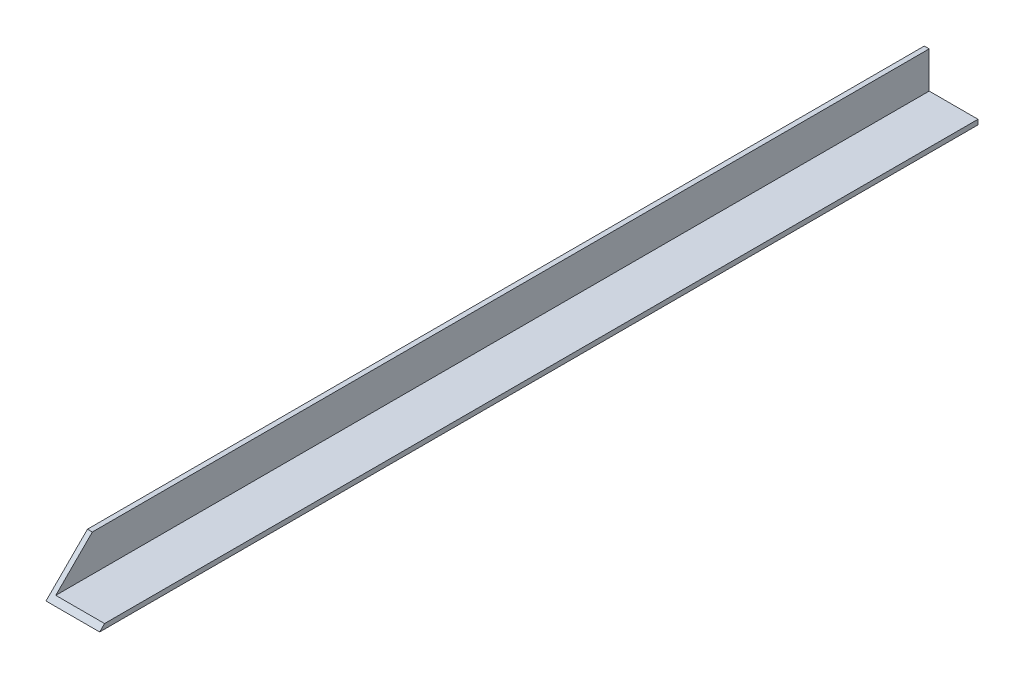
ISO-10303-21;
HEADER;
FILE_DESCRIPTION(('STEP AP214'),'2;1');
FILE_NAME('part.step','',(''),(''),'','','');
FILE_SCHEMA(('AUTOMOTIVE_DESIGN { 1 0 10303 214 1 1 1 1 }'));
ENDSEC;
DATA;
#1=APPLICATION_CONTEXT('core data for automotive mechanical design processes');
#2=APPLICATION_PROTOCOL_DEFINITION('international standard','automotive_design',2000,#1);
#3=PRODUCT_CONTEXT('',#1,'mechanical');
#4=PRODUCT('Part','Part','',(#3));
#5=PRODUCT_RELATED_PRODUCT_CATEGORY('part','',(#4));
#6=PRODUCT_DEFINITION_FORMATION('','',#4);
#7=PRODUCT_DEFINITION_CONTEXT('part definition',#1,'design');
#8=PRODUCT_DEFINITION('design','',#6,#7);
#9=PRODUCT_DEFINITION_SHAPE('','',#8);
#10=(LENGTH_UNIT() NAMED_UNIT(*) SI_UNIT(.MILLI.,.METRE.));
#11=(NAMED_UNIT(*) PLANE_ANGLE_UNIT() SI_UNIT($,.RADIAN.));
#12=(NAMED_UNIT(*) SI_UNIT($,.STERADIAN.) SOLID_ANGLE_UNIT());
#13=UNCERTAINTY_MEASURE_WITH_UNIT(LENGTH_MEASURE(1.E-05),#10,'distance_accuracy_value','');
#14=(GEOMETRIC_REPRESENTATION_CONTEXT(3) GLOBAL_UNCERTAINTY_ASSIGNED_CONTEXT((#13)) GLOBAL_UNIT_ASSIGNED_CONTEXT((#10,
#11,#12)) REPRESENTATION_CONTEXT('',''));
#15=CARTESIAN_POINT('',(0.,0.,0.));
#16=DIRECTION('',(0.,0.,1.));
#17=DIRECTION('',(1.,0.,0.));
#18=AXIS2_PLACEMENT_3D('',#15,#16,#17);
#19=CARTESIAN_POINT('',(0.,0.,-360.));
#20=DIRECTION('',(-1.,0.,0.));
#21=DIRECTION('',(0.,0.,1.));
#22=AXIS2_PLACEMENT_3D('',#19,#20,#21);
#23=PLANE('',#22);
#24=DIRECTION('',(0.,0.,1.));
#25=VECTOR('',#24,1.);
#26=CARTESIAN_POINT('',(0.,0.,-360.));
#27=LINE('',#26,#25);
#28=CARTESIAN_POINT('',(0.,0.,-360.));
#29=VERTEX_POINT('',#28);
#30=CARTESIAN_POINT('',(0.,0.,0.));
#31=VERTEX_POINT('',#30);
#32=EDGE_CURVE('E11',#29,#31,#27,.T.);
#33=ORIENTED_EDGE('',*,*,#32,.T.);
#34=DIRECTION('',(0.,0.707106781186551,-0.707106781186544));
#35=VECTOR('',#34,1.);
#36=CARTESIAN_POINT('',(0.,17.,-16.9999999999998));
#37=LINE('',#36,#35);
#38=CARTESIAN_POINT('',(0.,17.,-16.9999999999998));
#39=VERTEX_POINT('',#38);
#40=EDGE_CURVE('E94',#31,#39,#37,.T.);
#41=ORIENTED_EDGE('',*,*,#40,.T.);
#42=DIRECTION('',(0.,0.,1.));
#43=VECTOR('',#42,1.);
#44=CARTESIAN_POINT('',(0.,17.,-360.));
#45=LINE('',#44,#43);
#46=CARTESIAN_POINT('',(0.,17.,-360.));
#47=VERTEX_POINT('',#46);
#48=EDGE_CURVE('E51',#47,#39,#45,.T.);
#49=ORIENTED_EDGE('',*,*,#48,.F.);
#50=DIRECTION('',(0.,-1.,0.));
#51=VECTOR('',#50,1.);
#52=CARTESIAN_POINT('',(0.,0.,-360.));
#53=LINE('',#52,#51);
#54=EDGE_CURVE('E124',#47,#29,#53,.T.);
#55=ORIENTED_EDGE('',*,*,#54,.T.);
#56=EDGE_LOOP('',(#33,#41,#49,#55));
#57=FACE_BOUND('',#56,.T.);
#58=ADVANCED_FACE('F41',(#57),#23,.T.);
#59=CARTESIAN_POINT('',(0.,17.,-360.));
#60=DIRECTION('',(0.,1.,0.));
#61=DIRECTION('',(0.,0.,1.));
#62=AXIS2_PLACEMENT_3D('',#59,#60,#61);
#63=PLANE('',#62);
#64=ORIENTED_EDGE('',*,*,#48,.T.);
#65=DIRECTION('',(-1.,0.,0.));
#66=VECTOR('',#65,1.);
#67=CARTESIAN_POINT('',(22.,17.,-16.9999999999998));
#68=LINE('',#67,#66);
#69=CARTESIAN_POINT('',(2.,17.,-16.9999999999998));
#70=VERTEX_POINT('',#69);
#71=EDGE_CURVE('E91',#70,#39,#68,.T.);
#72=ORIENTED_EDGE('',*,*,#71,.F.);
#73=DIRECTION('',(0.,0.,1.));
#74=VECTOR('',#73,1.);
#75=CARTESIAN_POINT('',(2.,17.,-360.));
#76=LINE('',#75,#74);
#77=CARTESIAN_POINT('',(2.,17.,-360.));
#78=VERTEX_POINT('',#77);
#79=EDGE_CURVE('E111',#78,#70,#76,.T.);
#80=ORIENTED_EDGE('',*,*,#79,.F.);
#81=DIRECTION('',(-1.,0.,0.));
#82=VECTOR('',#81,1.);
#83=CARTESIAN_POINT('',(0.,17.,-360.));
#84=LINE('',#83,#82);
#85=EDGE_CURVE('E109',#78,#47,#84,.T.);
#86=ORIENTED_EDGE('',*,*,#85,.T.);
#87=EDGE_LOOP('',(#64,#72,#80,#86));
#88=FACE_BOUND('',#87,.T.);
#89=ADVANCED_FACE('F107',(#88),#63,.T.);
#90=CARTESIAN_POINT('',(2.,17.,-360.));
#91=DIRECTION('',(1.,0.,0.));
#92=DIRECTION('',(0.,1.,0.));
#93=AXIS2_PLACEMENT_3D('',#90,#91,#92);
#94=PLANE('',#93);
#95=ORIENTED_EDGE('',*,*,#79,.T.);
#96=DIRECTION('',(0.,-0.707106781186551,0.707106781186544));
#97=VECTOR('',#96,1.);
#98=CARTESIAN_POINT('',(1.99999999999998,188.5,-188.499999999998));
#99=LINE('',#98,#97);
#100=CARTESIAN_POINT('',(2.,2.,-1.99999999999995));
#101=VERTEX_POINT('',#100);
#102=EDGE_CURVE('E96',#70,#101,#99,.T.);
#103=ORIENTED_EDGE('',*,*,#102,.T.);
#104=DIRECTION('',(0.,0.,1.));
#105=VECTOR('',#104,1.);
#106=CARTESIAN_POINT('',(2.,2.,-360.));
#107=LINE('',#106,#105);
#108=CARTESIAN_POINT('',(2.,2.,-360.));
#109=VERTEX_POINT('',#108);
#110=EDGE_CURVE('E113',#109,#101,#107,.T.);
#111=ORIENTED_EDGE('',*,*,#110,.F.);
#112=DIRECTION('',(0.,1.,0.));
#113=VECTOR('',#112,1.);
#114=CARTESIAN_POINT('',(2.,17.,-360.));
#115=LINE('',#114,#113);
#116=EDGE_CURVE('E126',#109,#78,#115,.T.);
#117=ORIENTED_EDGE('',*,*,#116,.T.);
#118=EDGE_LOOP('',(#95,#103,#111,#117));
#119=FACE_BOUND('',#118,.T.);
#120=ADVANCED_FACE('F143',(#119),#94,.T.);
#121=CARTESIAN_POINT('',(2.,2.,-360.));
#122=DIRECTION('',(0.,1.,0.));
#123=DIRECTION('',(0.,0.,1.));
#124=AXIS2_PLACEMENT_3D('',#121,#122,#123);
#125=PLANE('',#124);
#126=ORIENTED_EDGE('',*,*,#110,.T.);
#127=DIRECTION('',(1.,0.,0.));
#128=VECTOR('',#127,1.);
#129=CARTESIAN_POINT('',(1.99999999999996,2.,-1.99999999999995));
#130=LINE('',#129,#128);
#131=CARTESIAN_POINT('',(22.,1.99999999999998,-1.99999999999996));
#132=VERTEX_POINT('',#131);
#133=EDGE_CURVE('E100',#101,#132,#130,.T.);
#134=ORIENTED_EDGE('',*,*,#133,.T.);
#135=DIRECTION('',(0.,0.,1.));
#136=VECTOR('',#135,1.);
#137=CARTESIAN_POINT('',(22.,2.,-360.));
#138=LINE('',#137,#136);
#139=CARTESIAN_POINT('',(22.,2.,-360.));
#140=VERTEX_POINT('',#139);
#141=EDGE_CURVE('E118',#140,#132,#138,.T.);
#142=ORIENTED_EDGE('',*,*,#141,.F.);
#143=DIRECTION('',(-1.,0.,0.));
#144=VECTOR('',#143,1.);
#145=CARTESIAN_POINT('',(2.,2.,-360.));
#146=LINE('',#145,#144);
#147=EDGE_CURVE('E139',#140,#109,#146,.T.);
#148=ORIENTED_EDGE('',*,*,#147,.T.);
#149=EDGE_LOOP('',(#126,#134,#142,#148));
#150=FACE_BOUND('',#149,.T.);
#151=ADVANCED_FACE('F149',(#150),#125,.T.);
#152=CARTESIAN_POINT('',(22.,2.,-360.));
#153=DIRECTION('',(1.,0.,0.));
#154=DIRECTION('',(0.,0.,-1.));
#155=AXIS2_PLACEMENT_3D('',#152,#153,#154);
#156=PLANE('',#155);
#157=ORIENTED_EDGE('',*,*,#141,.T.);
#158=DIRECTION('',(0.,0.707106781186551,-0.707106781186544));
#159=VECTOR('',#158,1.);
#160=CARTESIAN_POINT('',(22.,17.,-16.9999999999998));
#161=LINE('',#160,#159);
#162=CARTESIAN_POINT('',(22.,0.,0.));
#163=VERTEX_POINT('',#162);
#164=EDGE_CURVE('E101',#163,#132,#161,.T.);
#165=ORIENTED_EDGE('',*,*,#164,.F.);
#166=DIRECTION('',(0.,0.,1.));
#167=VECTOR('',#166,1.);
#168=CARTESIAN_POINT('',(22.,0.,-360.));
#169=LINE('',#168,#167);
#170=CARTESIAN_POINT('',(22.,0.,-360.));
#171=VERTEX_POINT('',#170);
#172=EDGE_CURVE('E45',#171,#163,#169,.T.);
#173=ORIENTED_EDGE('',*,*,#172,.F.);
#174=DIRECTION('',(0.,1.,0.));
#175=VECTOR('',#174,1.);
#176=CARTESIAN_POINT('',(22.,2.,-360.));
#177=LINE('',#176,#175);
#178=EDGE_CURVE('E131',#171,#140,#177,.T.);
#179=ORIENTED_EDGE('',*,*,#178,.T.);
#180=EDGE_LOOP('',(#157,#165,#173,#179));
#181=FACE_BOUND('',#180,.T.);
#182=ADVANCED_FACE('F151',(#181),#156,.T.);
#183=CARTESIAN_POINT('',(22.,0.,-360.));
#184=DIRECTION('',(0.,-1.,0.));
#185=DIRECTION('',(1.,0.,0.));
#186=AXIS2_PLACEMENT_3D('',#183,#184,#185);
#187=PLANE('',#186);
#188=DIRECTION('',(1.,0.,0.));
#189=VECTOR('',#188,1.);
#190=CARTESIAN_POINT('',(22.,0.,0.));
#191=LINE('',#190,#189);
#192=EDGE_CURVE('E129',#31,#163,#191,.T.);
#193=ORIENTED_EDGE('',*,*,#192,.F.);
#194=ORIENTED_EDGE('',*,*,#32,.F.);
#195=DIRECTION('',(1.,0.,0.));
#196=VECTOR('',#195,1.);
#197=CARTESIAN_POINT('',(22.,0.,-360.));
#198=LINE('',#197,#196);
#199=EDGE_CURVE('E130',#29,#171,#198,.T.);
#200=ORIENTED_EDGE('',*,*,#199,.T.);
#201=ORIENTED_EDGE('',*,*,#172,.T.);
#202=EDGE_LOOP('',(#193,#194,#200,#201));
#203=FACE_BOUND('',#202,.T.);
#204=ADVANCED_FACE('F43',(#203),#187,.T.);
#205=CARTESIAN_POINT('',(0.,0.,-360.));
#206=DIRECTION('',(0.,0.,-1.));
#207=DIRECTION('',(-1.,0.,0.));
#208=AXIS2_PLACEMENT_3D('',#205,#206,#207);
#209=PLANE('',#208);
#210=ORIENTED_EDGE('',*,*,#199,.F.);
#211=ORIENTED_EDGE('',*,*,#54,.F.);
#212=ORIENTED_EDGE('',*,*,#85,.F.);
#213=ORIENTED_EDGE('',*,*,#116,.F.);
#214=ORIENTED_EDGE('',*,*,#147,.F.);
#215=ORIENTED_EDGE('',*,*,#178,.F.);
#216=EDGE_LOOP('',(#210,#211,#212,#213,#214,#215));
#217=FACE_BOUND('',#216,.T.);
#218=ADVANCED_FACE('F146',(#217),#209,.T.);
#219=CARTESIAN_POINT('',(22.,17.,-16.9999999999998));
#220=DIRECTION('',(0.,0.707106781186544,0.707106781186551));
#221=DIRECTION('',(0.,-0.707106781186551,0.707106781186544));
#222=AXIS2_PLACEMENT_3D('',#219,#220,#221);
#223=PLANE('',#222);
#224=ORIENTED_EDGE('',*,*,#71,.T.);
#225=ORIENTED_EDGE('',*,*,#40,.F.);
#226=ORIENTED_EDGE('',*,*,#192,.T.);
#227=ORIENTED_EDGE('',*,*,#164,.T.);
#228=ORIENTED_EDGE('',*,*,#133,.F.);
#229=ORIENTED_EDGE('',*,*,#102,.F.);
#230=EDGE_LOOP('',(#224,#225,#226,#227,#228,#229));
#231=FACE_BOUND('',#230,.T.);
#232=ADVANCED_FACE('F93',(#231),#223,.T.);
#233=CLOSED_SHELL('',(#58,#89,#120,#151,#182,#204,#218,#232));
#234=MANIFOLD_SOLID_BREP('B2',#233);
#235=ADVANCED_BREP_SHAPE_REPRESENTATION('',(#18,#234),#14);
#236=SHAPE_DEFINITION_REPRESENTATION(#9,#235);
ENDSEC;
END-ISO-10303-21;
